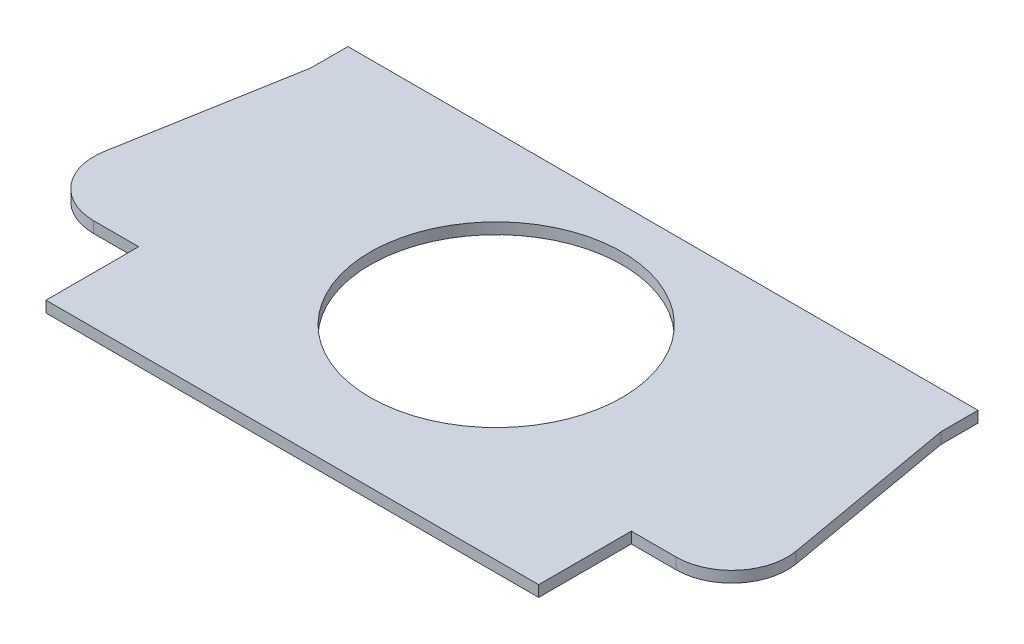
ISO-10303-21;
HEADER;
FILE_DESCRIPTION(('STEP AP214'),'2;1');
FILE_NAME('part.step','',(''),(''),'','','');
FILE_SCHEMA(('AUTOMOTIVE_DESIGN { 1 0 10303 214 1 1 1 1 }'));
ENDSEC;
DATA;
#1=APPLICATION_CONTEXT('core data for automotive mechanical design processes');
#2=APPLICATION_PROTOCOL_DEFINITION('international standard','automotive_design',2000,#1);
#3=PRODUCT_CONTEXT('',#1,'mechanical');
#4=PRODUCT('Part','Part','',(#3));
#5=PRODUCT_RELATED_PRODUCT_CATEGORY('part','',(#4));
#6=PRODUCT_DEFINITION_FORMATION('','',#4);
#7=PRODUCT_DEFINITION_CONTEXT('part definition',#1,'design');
#8=PRODUCT_DEFINITION('design','',#6,#7);
#9=PRODUCT_DEFINITION_SHAPE('','',#8);
#10=(LENGTH_UNIT() NAMED_UNIT(*) SI_UNIT(.MILLI.,.METRE.));
#11=(NAMED_UNIT(*) PLANE_ANGLE_UNIT() SI_UNIT($,.RADIAN.));
#12=(NAMED_UNIT(*) SI_UNIT($,.STERADIAN.) SOLID_ANGLE_UNIT());
#13=UNCERTAINTY_MEASURE_WITH_UNIT(LENGTH_MEASURE(1.E-05),#10,'distance_accuracy_value','');
#14=(GEOMETRIC_REPRESENTATION_CONTEXT(3) GLOBAL_UNCERTAINTY_ASSIGNED_CONTEXT((#13)) GLOBAL_UNIT_ASSIGNED_CONTEXT((#10,
#11,#12)) REPRESENTATION_CONTEXT('',''));
#15=CARTESIAN_POINT('',(0.,0.,0.));
#16=DIRECTION('',(0.,0.,1.));
#17=DIRECTION('',(1.,0.,0.));
#18=AXIS2_PLACEMENT_3D('',#15,#16,#17);
#19=CARTESIAN_POINT('',(-66.4612537460498,3.,0.));
#20=DIRECTION('',(1.,0.,0.));
#21=DIRECTION('',(0.,0.,-1.));
#22=AXIS2_PLACEMENT_3D('',#19,#20,#21);
#23=PLANE('',#22);
#24=DIRECTION('',(0.,0.,1.));
#25=VECTOR('',#24,1.);
#26=CARTESIAN_POINT('',(-66.4612537460498,0.,0.));
#27=LINE('',#26,#25);
#28=CARTESIAN_POINT('',(-66.4612537460498,0.,-25.));
#29=VERTEX_POINT('',#28);
#30=CARTESIAN_POINT('',(-66.4612537460498,0.,0.));
#31=VERTEX_POINT('',#30);
#32=EDGE_CURVE('E145',#29,#31,#27,.T.);
#33=ORIENTED_EDGE('',*,*,#32,.T.);
#34=DIRECTION('',(0.,-1.,0.));
#35=VECTOR('',#34,1.);
#36=CARTESIAN_POINT('',(-66.4612537460498,3.,0.));
#37=LINE('',#36,#35);
#38=CARTESIAN_POINT('',(-66.4612537460498,3.,0.));
#39=VERTEX_POINT('',#38);
#40=EDGE_CURVE('E126',#39,#31,#37,.T.);
#41=ORIENTED_EDGE('',*,*,#40,.F.);
#42=DIRECTION('',(0.,0.,1.));
#43=VECTOR('',#42,1.);
#44=CARTESIAN_POINT('',(-66.4612537460498,3.,0.));
#45=LINE('',#44,#43);
#46=CARTESIAN_POINT('',(-66.4612537460498,3.,-25.));
#47=VERTEX_POINT('',#46);
#48=EDGE_CURVE('E132',#47,#39,#45,.T.);
#49=ORIENTED_EDGE('',*,*,#48,.F.);
#50=DIRECTION('',(0.,-1.,0.));
#51=VECTOR('',#50,1.);
#52=CARTESIAN_POINT('',(-66.4612537460498,3.,-25.));
#53=LINE('',#52,#51);
#54=EDGE_CURVE('E198',#47,#29,#53,.T.);
#55=ORIENTED_EDGE('',*,*,#54,.T.);
#56=EDGE_LOOP('',(#33,#41,#49,#55));
#57=FACE_BOUND('',#56,.T.);
#58=ADVANCED_FACE('F33',(#57),#23,.F.);
#59=CARTESIAN_POINT('',(66.4612537460498,3.,0.));
#60=DIRECTION('',(0.,0.,-1.));
#61=DIRECTION('',(-1.,0.,0.));
#62=AXIS2_PLACEMENT_3D('',#59,#60,#61);
#63=PLANE('',#62);
#64=DIRECTION('',(1.,0.,0.));
#65=VECTOR('',#64,1.);
#66=CARTESIAN_POINT('',(66.4612537460498,0.,0.));
#67=LINE('',#66,#65);
#68=CARTESIAN_POINT('',(66.4612537460498,0.,0.));
#69=VERTEX_POINT('',#68);
#70=EDGE_CURVE('E216',#31,#69,#67,.T.);
#71=ORIENTED_EDGE('',*,*,#70,.T.);
#72=DIRECTION('',(0.,-1.,0.));
#73=VECTOR('',#72,1.);
#74=CARTESIAN_POINT('',(66.4612537460498,3.,0.));
#75=LINE('',#74,#73);
#76=CARTESIAN_POINT('',(66.4612537460498,3.,0.));
#77=VERTEX_POINT('',#76);
#78=EDGE_CURVE('E129',#77,#69,#75,.T.);
#79=ORIENTED_EDGE('',*,*,#78,.F.);
#80=DIRECTION('',(1.,0.,0.));
#81=VECTOR('',#80,1.);
#82=CARTESIAN_POINT('',(66.4612537460498,3.,0.));
#83=LINE('',#82,#81);
#84=EDGE_CURVE('E122',#39,#77,#83,.T.);
#85=ORIENTED_EDGE('',*,*,#84,.F.);
#86=ORIENTED_EDGE('',*,*,#40,.T.);
#87=EDGE_LOOP('',(#71,#79,#85,#86));
#88=FACE_BOUND('',#87,.T.);
#89=ADVANCED_FACE('F124',(#88),#63,.F.);
#90=CARTESIAN_POINT('',(66.4612537460498,3.,0.));
#91=DIRECTION('',(-1.,0.,0.));
#92=DIRECTION('',(0.,0.,1.));
#93=AXIS2_PLACEMENT_3D('',#90,#91,#92);
#94=PLANE('',#93);
#95=DIRECTION('',(0.,0.,-1.));
#96=VECTOR('',#95,1.);
#97=CARTESIAN_POINT('',(66.4612537460498,0.,0.));
#98=LINE('',#97,#96);
#99=CARTESIAN_POINT('',(66.4612537460498,0.,-25.));
#100=VERTEX_POINT('',#99);
#101=EDGE_CURVE('E187',#69,#100,#98,.T.);
#102=ORIENTED_EDGE('',*,*,#101,.T.);
#103=DIRECTION('',(0.,-1.,0.));
#104=VECTOR('',#103,1.);
#105=CARTESIAN_POINT('',(66.4612537460498,3.,-25.));
#106=LINE('',#105,#104);
#107=CARTESIAN_POINT('',(66.4612537460498,3.,-25.));
#108=VERTEX_POINT('',#107);
#109=EDGE_CURVE('E151',#108,#100,#106,.T.);
#110=ORIENTED_EDGE('',*,*,#109,.F.);
#111=DIRECTION('',(0.,0.,-1.));
#112=VECTOR('',#111,1.);
#113=CARTESIAN_POINT('',(66.4612537460498,3.,0.));
#114=LINE('',#113,#112);
#115=EDGE_CURVE('E131',#77,#108,#114,.T.);
#116=ORIENTED_EDGE('',*,*,#115,.F.);
#117=ORIENTED_EDGE('',*,*,#78,.T.);
#118=EDGE_LOOP('',(#102,#110,#116,#117));
#119=FACE_BOUND('',#118,.T.);
#120=ADVANCED_FACE('F256',(#119),#94,.F.);
#121=CARTESIAN_POINT('',(66.4612537460498,3.,-25.));
#122=DIRECTION('',(0.,0.,-1.));
#123=DIRECTION('',(-1.,0.,0.));
#124=AXIS2_PLACEMENT_3D('',#121,#122,#123);
#125=PLANE('',#124);
#126=DIRECTION('',(1.,0.,0.));
#127=VECTOR('',#126,1.);
#128=CARTESIAN_POINT('',(66.4612537460498,0.,-25.));
#129=LINE('',#128,#127);
#130=CARTESIAN_POINT('',(78.5849498571368,0.,-25.));
#131=VERTEX_POINT('',#130);
#132=EDGE_CURVE('E183',#100,#131,#129,.T.);
#133=ORIENTED_EDGE('',*,*,#132,.T.);
#134=DIRECTION('',(0.,-1.,0.));
#135=VECTOR('',#134,1.);
#136=CARTESIAN_POINT('',(78.5849498571368,3.,-25.));
#137=LINE('',#136,#135);
#138=CARTESIAN_POINT('',(78.5849498571368,3.,-25.));
#139=VERTEX_POINT('',#138);
#140=EDGE_CURVE('E11',#131,#139,#137,.F.);
#141=ORIENTED_EDGE('',*,*,#140,.T.);
#142=DIRECTION('',(1.,0.,0.));
#143=VECTOR('',#142,1.);
#144=CARTESIAN_POINT('',(66.4612537460498,3.,-25.));
#145=LINE('',#144,#143);
#146=EDGE_CURVE('E213',#108,#139,#145,.T.);
#147=ORIENTED_EDGE('',*,*,#146,.F.);
#148=ORIENTED_EDGE('',*,*,#109,.T.);
#149=EDGE_LOOP('',(#133,#141,#147,#148));
#150=FACE_BOUND('',#149,.T.);
#151=ADVANCED_FACE('F212',(#150),#125,.F.);
#152=CARTESIAN_POINT('',(85.,3.,-90.));
#153=DIRECTION('',(-0.984807753012209,0.,0.173648177666924));
#154=DIRECTION('',(0.173648177666924,0.,0.984807753012209));
#155=AXIS2_PLACEMENT_3D('',#152,#153,#154);
#156=PLANE('',#155);
#157=DIRECTION('',(-0.173648177666924,0.,-0.984807753012209));
#158=VECTOR('',#157,1.);
#159=CARTESIAN_POINT('',(85.,3.,-90.));
#160=LINE('',#159,#158);
#161=CARTESIAN_POINT('',(93.3570661523199,3.,-42.6047226650039));
#162=VERTEX_POINT('',#161);
#163=CARTESIAN_POINT('',(85.,3.,-90.));
#164=VERTEX_POINT('',#163);
#165=EDGE_CURVE('E174',#162,#164,#160,.T.);
#166=ORIENTED_EDGE('',*,*,#165,.F.);
#167=DIRECTION('',(0.,-1.,0.));
#168=VECTOR('',#167,1.);
#169=CARTESIAN_POINT('',(93.3570661523199,3.,-42.6047226650039));
#170=LINE('',#169,#168);
#171=CARTESIAN_POINT('',(93.3570661523199,0.,-42.6047226650039));
#172=VERTEX_POINT('',#171);
#173=EDGE_CURVE('E41',#162,#172,#170,.T.);
#174=ORIENTED_EDGE('',*,*,#173,.T.);
#175=DIRECTION('',(-0.173648177666924,0.,-0.984807753012209));
#176=VECTOR('',#175,1.);
#177=CARTESIAN_POINT('',(85.,0.,-90.));
#178=LINE('',#177,#176);
#179=CARTESIAN_POINT('',(85.,0.,-90.));
#180=VERTEX_POINT('',#179);
#181=EDGE_CURVE('E172',#172,#180,#178,.T.);
#182=ORIENTED_EDGE('',*,*,#181,.T.);
#183=DIRECTION('',(0.,-1.,0.));
#184=VECTOR('',#183,1.);
#185=CARTESIAN_POINT('',(85.,3.,-90.));
#186=LINE('',#185,#184);
#187=EDGE_CURVE('E209',#164,#180,#186,.T.);
#188=ORIENTED_EDGE('',*,*,#187,.F.);
#189=EDGE_LOOP('',(#166,#174,#182,#188));
#190=FACE_BOUND('',#189,.T.);
#191=ADVANCED_FACE('F170',(#190),#156,.F.);
#192=CARTESIAN_POINT('',(85.,3.,-90.));
#193=DIRECTION('',(-1.,0.,0.));
#194=DIRECTION('',(0.,0.,1.));
#195=AXIS2_PLACEMENT_3D('',#192,#193,#194);
#196=PLANE('',#195);
#197=DIRECTION('',(0.,0.,-1.));
#198=VECTOR('',#197,1.);
#199=CARTESIAN_POINT('',(85.,0.,-90.));
#200=LINE('',#199,#198);
#201=CARTESIAN_POINT('',(85.,0.,-100.));
#202=VERTEX_POINT('',#201);
#203=EDGE_CURVE('E182',#180,#202,#200,.T.);
#204=ORIENTED_EDGE('',*,*,#203,.T.);
#205=DIRECTION('',(0.,-1.,0.));
#206=VECTOR('',#205,1.);
#207=CARTESIAN_POINT('',(85.,3.,-100.));
#208=LINE('',#207,#206);
#209=CARTESIAN_POINT('',(85.,3.,-100.));
#210=VERTEX_POINT('',#209);
#211=EDGE_CURVE('E206',#210,#202,#208,.T.);
#212=ORIENTED_EDGE('',*,*,#211,.F.);
#213=DIRECTION('',(0.,0.,-1.));
#214=VECTOR('',#213,1.);
#215=CARTESIAN_POINT('',(85.,3.,-90.));
#216=LINE('',#215,#214);
#217=EDGE_CURVE('E227',#164,#210,#216,.T.);
#218=ORIENTED_EDGE('',*,*,#217,.F.);
#219=ORIENTED_EDGE('',*,*,#187,.T.);
#220=EDGE_LOOP('',(#204,#212,#218,#219));
#221=FACE_BOUND('',#220,.T.);
#222=ADVANCED_FACE('F284',(#221),#196,.F.);
#223=CARTESIAN_POINT('',(85.,3.,-100.));
#224=DIRECTION('',(0.,0.,1.));
#225=DIRECTION('',(1.,0.,0.));
#226=AXIS2_PLACEMENT_3D('',#223,#224,#225);
#227=PLANE('',#226);
#228=DIRECTION('',(-1.,0.,0.));
#229=VECTOR('',#228,1.);
#230=CARTESIAN_POINT('',(85.,0.,-100.));
#231=LINE('',#230,#229);
#232=CARTESIAN_POINT('',(-85.,0.,-100.));
#233=VERTEX_POINT('',#232);
#234=EDGE_CURVE('E185',#202,#233,#231,.T.);
#235=ORIENTED_EDGE('',*,*,#234,.T.);
#236=DIRECTION('',(0.,-1.,0.));
#237=VECTOR('',#236,1.);
#238=CARTESIAN_POINT('',(-85.,3.,-100.));
#239=LINE('',#238,#237);
#240=CARTESIAN_POINT('',(-85.,3.,-100.));
#241=VERTEX_POINT('',#240);
#242=EDGE_CURVE('E203',#241,#233,#239,.T.);
#243=ORIENTED_EDGE('',*,*,#242,.F.);
#244=DIRECTION('',(-1.,0.,0.));
#245=VECTOR('',#244,1.);
#246=CARTESIAN_POINT('',(85.,3.,-100.));
#247=LINE('',#246,#245);
#248=EDGE_CURVE('E225',#210,#241,#247,.T.);
#249=ORIENTED_EDGE('',*,*,#248,.F.);
#250=ORIENTED_EDGE('',*,*,#211,.T.);
#251=EDGE_LOOP('',(#235,#243,#249,#250));
#252=FACE_BOUND('',#251,.T.);
#253=ADVANCED_FACE('F279',(#252),#227,.F.);
#254=CARTESIAN_POINT('',(-85.,3.,-90.0000000000001));
#255=DIRECTION('',(1.,0.,0.));
#256=DIRECTION('',(0.,0.,-1.));
#257=AXIS2_PLACEMENT_3D('',#254,#255,#256);
#258=PLANE('',#257);
#259=DIRECTION('',(0.,0.,1.));
#260=VECTOR('',#259,1.);
#261=CARTESIAN_POINT('',(-85.,0.,-90.0000000000001));
#262=LINE('',#261,#260);
#263=CARTESIAN_POINT('',(-85.,0.,-90.0000000000001));
#264=VERTEX_POINT('',#263);
#265=EDGE_CURVE('E192',#233,#264,#262,.T.);
#266=ORIENTED_EDGE('',*,*,#265,.T.);
#267=DIRECTION('',(0.,-1.,0.));
#268=VECTOR('',#267,1.);
#269=CARTESIAN_POINT('',(-85.,3.,-90.0000000000001));
#270=LINE('',#269,#268);
#271=CARTESIAN_POINT('',(-85.,3.,-90.0000000000001));
#272=VERTEX_POINT('',#271);
#273=EDGE_CURVE('E200',#272,#264,#270,.T.);
#274=ORIENTED_EDGE('',*,*,#273,.F.);
#275=DIRECTION('',(0.,0.,1.));
#276=VECTOR('',#275,1.);
#277=CARTESIAN_POINT('',(-85.,3.,-90.0000000000001));
#278=LINE('',#277,#276);
#279=EDGE_CURVE('E223',#241,#272,#278,.T.);
#280=ORIENTED_EDGE('',*,*,#279,.F.);
#281=ORIENTED_EDGE('',*,*,#242,.T.);
#282=EDGE_LOOP('',(#266,#274,#280,#281));
#283=FACE_BOUND('',#282,.T.);
#284=ADVANCED_FACE('F276',(#283),#258,.F.);
#285=CARTESIAN_POINT('',(-85.,3.,-90.0000000000001));
#286=DIRECTION('',(0.984807753012209,0.,0.173648177666923));
#287=DIRECTION('',(0.173648177666923,0.,-0.984807753012209));
#288=AXIS2_PLACEMENT_3D('',#285,#286,#287);
#289=PLANE('',#288);
#290=DIRECTION('',(-0.173648177666923,0.,0.984807753012209));
#291=VECTOR('',#290,1.);
#292=CARTESIAN_POINT('',(-85.,0.,-90.0000000000001));
#293=LINE('',#292,#291);
#294=CARTESIAN_POINT('',(-93.3570661523199,0.,-42.6047226650038));
#295=VERTEX_POINT('',#294);
#296=EDGE_CURVE('E194',#264,#295,#293,.T.);
#297=ORIENTED_EDGE('',*,*,#296,.T.);
#298=DIRECTION('',(0.,-1.,0.));
#299=VECTOR('',#298,1.);
#300=CARTESIAN_POINT('',(-93.3570661523199,3.,-42.6047226650038));
#301=LINE('',#300,#299);
#302=CARTESIAN_POINT('',(-93.3570661523199,3.,-42.6047226650038));
#303=VERTEX_POINT('',#302);
#304=EDGE_CURVE('E162',#295,#303,#301,.F.);
#305=ORIENTED_EDGE('',*,*,#304,.T.);
#306=DIRECTION('',(-0.173648177666923,0.,0.984807753012209));
#307=VECTOR('',#306,1.);
#308=CARTESIAN_POINT('',(-85.,3.,-90.0000000000001));
#309=LINE('',#308,#307);
#310=EDGE_CURVE('E221',#272,#303,#309,.T.);
#311=ORIENTED_EDGE('',*,*,#310,.F.);
#312=ORIENTED_EDGE('',*,*,#273,.T.);
#313=EDGE_LOOP('',(#297,#305,#311,#312));
#314=FACE_BOUND('',#313,.T.);
#315=ADVANCED_FACE('F247',(#314),#289,.F.);
#316=CARTESIAN_POINT('',(-66.4612537460498,3.,-25.));
#317=DIRECTION('',(0.,0.,-1.));
#318=DIRECTION('',(-1.,0.,0.));
#319=AXIS2_PLACEMENT_3D('',#316,#317,#318);
#320=PLANE('',#319);
#321=DIRECTION('',(1.,0.,0.));
#322=VECTOR('',#321,1.);
#323=CARTESIAN_POINT('',(-66.4612537460498,3.,-25.));
#324=LINE('',#323,#322);
#325=CARTESIAN_POINT('',(-78.5849498571367,3.,-25.));
#326=VERTEX_POINT('',#325);
#327=EDGE_CURVE('E138',#326,#47,#324,.T.);
#328=ORIENTED_EDGE('',*,*,#327,.F.);
#329=DIRECTION('',(0.,-1.,0.));
#330=VECTOR('',#329,1.);
#331=CARTESIAN_POINT('',(-78.5849498571367,3.,-25.));
#332=LINE('',#331,#330);
#333=CARTESIAN_POINT('',(-78.5849498571367,0.,-25.));
#334=VERTEX_POINT('',#333);
#335=EDGE_CURVE('E146',#326,#334,#332,.T.);
#336=ORIENTED_EDGE('',*,*,#335,.T.);
#337=DIRECTION('',(1.,0.,0.));
#338=VECTOR('',#337,1.);
#339=CARTESIAN_POINT('',(-66.4612537460498,0.,-25.));
#340=LINE('',#339,#338);
#341=EDGE_CURVE('E142',#334,#29,#340,.T.);
#342=ORIENTED_EDGE('',*,*,#341,.T.);
#343=ORIENTED_EDGE('',*,*,#54,.F.);
#344=EDGE_LOOP('',(#328,#336,#342,#343));
#345=FACE_BOUND('',#344,.T.);
#346=ADVANCED_FACE('F239',(#345),#320,.F.);
#347=CARTESIAN_POINT('',(0.,3.,0.));
#348=DIRECTION('',(0.,1.,0.));
#349=DIRECTION('',(0.,0.,1.));
#350=AXIS2_PLACEMENT_3D('',#347,#348,#349);
#351=PLANE('',#350);
#352=CARTESIAN_POINT('',(0.,3.,-55.0000000000001));
#353=DIRECTION('',(0.,1.,0.));
#354=DIRECTION('',(0.,0.,1.));
#355=AXIS2_PLACEMENT_3D('',#352,#353,#354);
#356=CIRCLE('',#355,34.);
#357=CARTESIAN_POINT('',(0.,3.,-21.0000000000001));
#358=VERTEX_POINT('',#357);
#359=EDGE_CURVE('E157',#358,#358,#356,.T.);
#360=ORIENTED_EDGE('',*,*,#359,.F.);
#361=EDGE_LOOP('',(#360));
#362=FACE_BOUND('',#361,.T.);
#363=ORIENTED_EDGE('',*,*,#310,.T.);
#364=CARTESIAN_POINT('',(-78.5849498571367,3.,-40.));
#365=DIRECTION('',(0.,1.,0.));
#366=DIRECTION('',(0.,0.,1.));
#367=AXIS2_PLACEMENT_3D('',#364,#365,#366);
#368=CIRCLE('',#367,15.);
#369=EDGE_CURVE('E165',#303,#326,#368,.T.);
#370=ORIENTED_EDGE('',*,*,#369,.T.);
#371=ORIENTED_EDGE('',*,*,#327,.T.);
#372=ORIENTED_EDGE('',*,*,#48,.T.);
#373=ORIENTED_EDGE('',*,*,#84,.T.);
#374=ORIENTED_EDGE('',*,*,#115,.T.);
#375=ORIENTED_EDGE('',*,*,#146,.T.);
#376=CARTESIAN_POINT('',(78.5849498571368,3.,-40.));
#377=DIRECTION('',(0.,1.,0.));
#378=DIRECTION('',(0.,0.,1.));
#379=AXIS2_PLACEMENT_3D('',#376,#377,#378);
#380=CIRCLE('',#379,15.);
#381=EDGE_CURVE('E48',#139,#162,#380,.T.);
#382=ORIENTED_EDGE('',*,*,#381,.T.);
#383=ORIENTED_EDGE('',*,*,#165,.T.);
#384=ORIENTED_EDGE('',*,*,#217,.T.);
#385=ORIENTED_EDGE('',*,*,#248,.T.);
#386=ORIENTED_EDGE('',*,*,#279,.T.);
#387=EDGE_LOOP('',(#363,#370,#371,#372,#373,#374,#375,#382,#383,#384,#385,#386));
#388=FACE_BOUND('',#387,.T.);
#389=ADVANCED_FACE('F136',(#362,#388),#351,.T.);
#390=CARTESIAN_POINT('',(0.,0.,0.));
#391=DIRECTION('',(0.,1.,0.));
#392=DIRECTION('',(0.,0.,1.));
#393=AXIS2_PLACEMENT_3D('',#390,#391,#392);
#394=PLANE('',#393);
#395=CARTESIAN_POINT('',(0.,0.,-55.0000000000001));
#396=DIRECTION('',(0.,1.,0.));
#397=DIRECTION('',(0.,0.,1.));
#398=AXIS2_PLACEMENT_3D('',#395,#396,#397);
#399=CIRCLE('',#398,34.);
#400=CARTESIAN_POINT('',(0.,0.,-21.0000000000001));
#401=VERTEX_POINT('',#400);
#402=EDGE_CURVE('E155',#401,#401,#399,.T.);
#403=ORIENTED_EDGE('',*,*,#402,.T.);
#404=EDGE_LOOP('',(#403));
#405=FACE_BOUND('',#404,.T.);
#406=ORIENTED_EDGE('',*,*,#341,.F.);
#407=CARTESIAN_POINT('',(-78.5849498571367,0.,-40.));
#408=DIRECTION('',(0.,1.,0.));
#409=DIRECTION('',(0.,0.,1.));
#410=AXIS2_PLACEMENT_3D('',#407,#408,#409);
#411=CIRCLE('',#410,15.);
#412=EDGE_CURVE('E160',#334,#295,#411,.F.);
#413=ORIENTED_EDGE('',*,*,#412,.T.);
#414=ORIENTED_EDGE('',*,*,#296,.F.);
#415=ORIENTED_EDGE('',*,*,#265,.F.);
#416=ORIENTED_EDGE('',*,*,#234,.F.);
#417=ORIENTED_EDGE('',*,*,#203,.F.);
#418=ORIENTED_EDGE('',*,*,#181,.F.);
#419=CARTESIAN_POINT('',(78.5849498571368,0.,-40.));
#420=DIRECTION('',(0.,1.,0.));
#421=DIRECTION('',(0.,0.,1.));
#422=AXIS2_PLACEMENT_3D('',#419,#420,#421);
#423=CIRCLE('',#422,15.);
#424=EDGE_CURVE('E149',#172,#131,#423,.F.);
#425=ORIENTED_EDGE('',*,*,#424,.T.);
#426=ORIENTED_EDGE('',*,*,#132,.F.);
#427=ORIENTED_EDGE('',*,*,#101,.F.);
#428=ORIENTED_EDGE('',*,*,#70,.F.);
#429=ORIENTED_EDGE('',*,*,#32,.F.);
#430=EDGE_LOOP('',(#406,#413,#414,#415,#416,#417,#418,#425,#426,#427,#428,#429));
#431=FACE_BOUND('',#430,.T.);
#432=ADVANCED_FACE('F179',(#405,#431),#394,.F.);
#433=CARTESIAN_POINT('',(0.,-9.,-55.0000000000001));
#434=DIRECTION('',(0.,1.,0.));
#435=DIRECTION('',(0.,0.,1.));
#436=AXIS2_PLACEMENT_3D('',#433,#434,#435);
#437=CYLINDRICAL_SURFACE('',#436,34.);
#438=ORIENTED_EDGE('',*,*,#359,.T.);
#439=EDGE_LOOP('',(#438));
#440=FACE_BOUND('',#439,.T.);
#441=ORIENTED_EDGE('',*,*,#402,.F.);
#442=EDGE_LOOP('',(#441));
#443=FACE_BOUND('',#442,.T.);
#444=ADVANCED_FACE('F235',(#440,#443),#437,.F.);
#445=CARTESIAN_POINT('',(-78.5849498571367,3.,-40.));
#446=DIRECTION('',(0.,-1.,0.));
#447=DIRECTION('',(0.,0.,-1.));
#448=AXIS2_PLACEMENT_3D('',#445,#446,#447);
#449=CYLINDRICAL_SURFACE('',#448,15.);
#450=ORIENTED_EDGE('',*,*,#369,.F.);
#451=ORIENTED_EDGE('',*,*,#304,.F.);
#452=ORIENTED_EDGE('',*,*,#412,.F.);
#453=ORIENTED_EDGE('',*,*,#335,.F.);
#454=EDGE_LOOP('',(#450,#451,#452,#453));
#455=FACE_BOUND('',#454,.T.);
#456=ADVANCED_FACE('F259',(#455),#449,.T.);
#457=CARTESIAN_POINT('',(78.5849498571368,3.,-40.));
#458=DIRECTION('',(0.,-1.,0.));
#459=DIRECTION('',(0.,0.,-1.));
#460=AXIS2_PLACEMENT_3D('',#457,#458,#459);
#461=CYLINDRICAL_SURFACE('',#460,15.);
#462=ORIENTED_EDGE('',*,*,#381,.F.);
#463=ORIENTED_EDGE('',*,*,#140,.F.);
#464=ORIENTED_EDGE('',*,*,#424,.F.);
#465=ORIENTED_EDGE('',*,*,#173,.F.);
#466=EDGE_LOOP('',(#462,#463,#464,#465));
#467=FACE_BOUND('',#466,.T.);
#468=ADVANCED_FACE('F35',(#467),#461,.T.);
#469=CLOSED_SHELL('',(#58,#89,#120,#151,#191,#222,#253,#284,#315,#346,#389,#432,#444,#456,#468));
#470=MANIFOLD_SOLID_BREP('B2',#469);
#471=ADVANCED_BREP_SHAPE_REPRESENTATION('',(#18,#470),#14);
#472=SHAPE_DEFINITION_REPRESENTATION(#9,#471);
ENDSEC;
END-ISO-10303-21;
